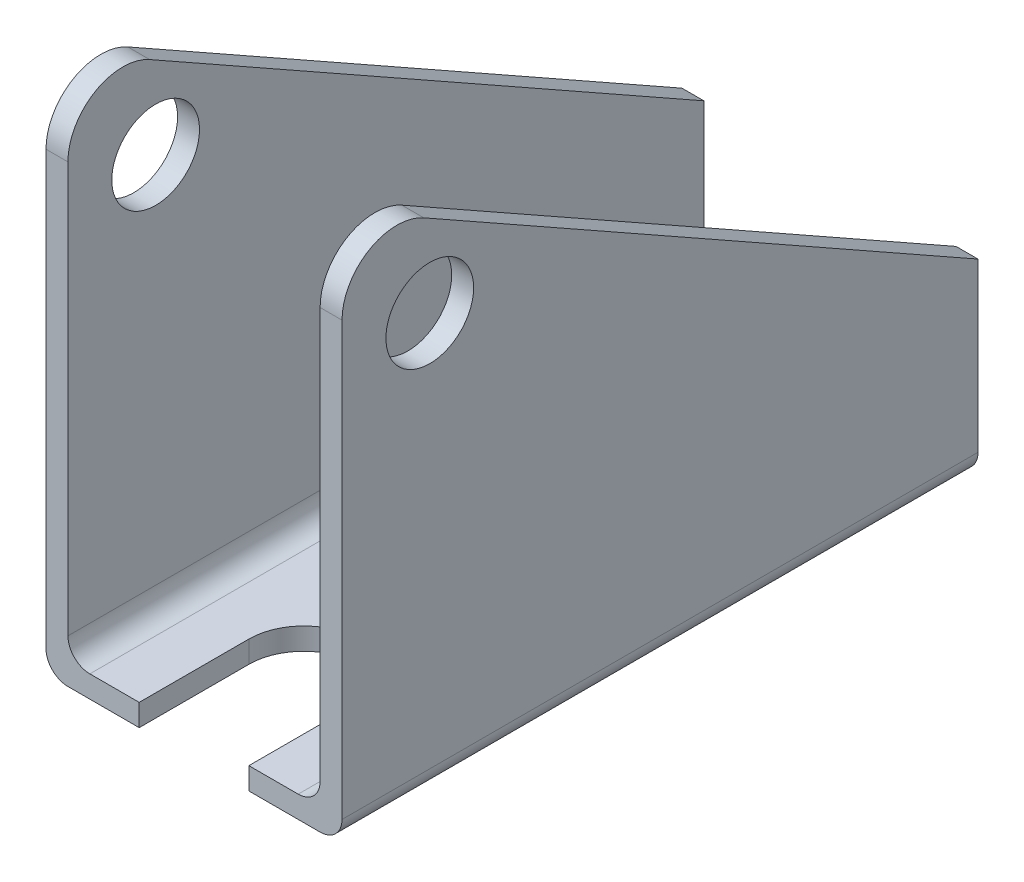
ISO-10303-21;
HEADER;
FILE_DESCRIPTION(('STEP AP214'),'2;1');
FILE_NAME('part.step','',(''),(''),'','','');
FILE_SCHEMA(('AUTOMOTIVE_DESIGN { 1 0 10303 214 1 1 1 1 }'));
ENDSEC;
DATA;
#1=APPLICATION_CONTEXT('core data for automotive mechanical design processes');
#2=APPLICATION_PROTOCOL_DEFINITION('international standard','automotive_design',2000,#1);
#3=PRODUCT_CONTEXT('',#1,'mechanical');
#4=PRODUCT('Part','Part','',(#3));
#5=PRODUCT_RELATED_PRODUCT_CATEGORY('part','',(#4));
#6=PRODUCT_DEFINITION_FORMATION('','',#4);
#7=PRODUCT_DEFINITION_CONTEXT('part definition',#1,'design');
#8=PRODUCT_DEFINITION('design','',#6,#7);
#9=PRODUCT_DEFINITION_SHAPE('','',#8);
#10=(LENGTH_UNIT() NAMED_UNIT(*) SI_UNIT(.MILLI.,.METRE.));
#11=(NAMED_UNIT(*) PLANE_ANGLE_UNIT() SI_UNIT($,.RADIAN.));
#12=(NAMED_UNIT(*) SI_UNIT($,.STERADIAN.) SOLID_ANGLE_UNIT());
#13=UNCERTAINTY_MEASURE_WITH_UNIT(LENGTH_MEASURE(1.E-05),#10,'distance_accuracy_value','');
#14=(GEOMETRIC_REPRESENTATION_CONTEXT(3) GLOBAL_UNCERTAINTY_ASSIGNED_CONTEXT((#13)) GLOBAL_UNIT_ASSIGNED_CONTEXT((#10,
#11,#12)) REPRESENTATION_CONTEXT('',''));
#15=CARTESIAN_POINT('',(0.,0.,0.));
#16=DIRECTION('',(0.,0.,1.));
#17=DIRECTION('',(1.,0.,0.));
#18=AXIS2_PLACEMENT_3D('',#15,#16,#17);
#19=CARTESIAN_POINT('',(-13.5,2.,29.));
#20=DIRECTION('',(0.,0.,-1.));
#21=DIRECTION('',(-1.,0.,0.));
#22=AXIS2_PLACEMENT_3D('',#19,#20,#21);
#23=PLANE('',#22);
#24=DIRECTION('',(1.,0.,0.));
#25=VECTOR('',#24,1.);
#26=CARTESIAN_POINT('',(-13.5,0.,29.));
#27=LINE('',#26,#25);
#28=CARTESIAN_POINT('',(-11.5,0.,29.));
#29=VERTEX_POINT('',#28);
#30=CARTESIAN_POINT('',(-5.,0.,29.));
#31=VERTEX_POINT('',#30);
#32=EDGE_CURVE('E336',#29,#31,#27,.T.);
#33=ORIENTED_EDGE('',*,*,#32,.T.);
#34=DIRECTION('',(0.,1.,0.));
#35=VECTOR('',#34,1.);
#36=CARTESIAN_POINT('',(-5.,2.,29.));
#37=LINE('',#36,#35);
#38=CARTESIAN_POINT('',(-5.,2.00000000000002,29.));
#39=VERTEX_POINT('',#38);
#40=EDGE_CURVE('E55',#31,#39,#37,.T.);
#41=ORIENTED_EDGE('',*,*,#40,.T.);
#42=DIRECTION('',(1.,0.,0.));
#43=VECTOR('',#42,1.);
#44=CARTESIAN_POINT('',(-13.5,2.,29.));
#45=LINE('',#44,#43);
#46=CARTESIAN_POINT('',(-9.49999999999998,2.,29.));
#47=VERTEX_POINT('',#46);
#48=EDGE_CURVE('E337',#47,#39,#45,.T.);
#49=ORIENTED_EDGE('',*,*,#48,.F.);
#50=CARTESIAN_POINT('',(-9.49999999999999,4.,29.));
#51=DIRECTION('',(0.,0.,-1.));
#52=DIRECTION('',(1.,0.,0.));
#53=AXIS2_PLACEMENT_3D('',#50,#51,#52);
#54=CIRCLE('',#53,2.);
#55=CARTESIAN_POINT('',(-11.5,4.00000000000001,29.));
#56=VERTEX_POINT('',#55);
#57=EDGE_CURVE('E310',#47,#56,#54,.T.);
#58=ORIENTED_EDGE('',*,*,#57,.T.);
#59=DIRECTION('',(0.,1.,0.));
#60=VECTOR('',#59,1.);
#61=CARTESIAN_POINT('',(-11.5,50.,29.));
#62=LINE('',#61,#60);
#63=CARTESIAN_POINT('',(-11.5,41.4361944646601,29.));
#64=VERTEX_POINT('',#63);
#65=EDGE_CURVE('E291',#56,#64,#62,.T.);
#66=ORIENTED_EDGE('',*,*,#65,.T.);
#67=DIRECTION('',(1.,0.,0.));
#68=VECTOR('',#67,1.);
#69=CARTESIAN_POINT('',(-44.5,41.4361944646601,29.));
#70=LINE('',#69,#68);
#71=CARTESIAN_POINT('',(-13.5,41.4361944646601,29.));
#72=VERTEX_POINT('',#71);
#73=EDGE_CURVE('E246',#72,#64,#70,.T.);
#74=ORIENTED_EDGE('',*,*,#73,.F.);
#75=DIRECTION('',(0.,-1.,0.));
#76=VECTOR('',#75,1.);
#77=CARTESIAN_POINT('',(-13.5,2.,29.));
#78=LINE('',#77,#76);
#79=CARTESIAN_POINT('',(-13.5,2.00000000000001,29.));
#80=VERTEX_POINT('',#79);
#81=EDGE_CURVE('E350',#72,#80,#78,.T.);
#82=ORIENTED_EDGE('',*,*,#81,.T.);
#83=CARTESIAN_POINT('',(-11.5,2.,29.));
#84=DIRECTION('',(0.,0.,-1.));
#85=DIRECTION('',(1.,0.,0.));
#86=AXIS2_PLACEMENT_3D('',#83,#84,#85);
#87=CIRCLE('',#86,2.);
#88=EDGE_CURVE('E214',#29,#80,#87,.T.);
#89=ORIENTED_EDGE('',*,*,#88,.F.);
#90=EDGE_LOOP('',(#33,#41,#49,#58,#66,#74,#82,#89));
#91=FACE_BOUND('',#90,.T.);
#92=ADVANCED_FACE('F45',(#91),#23,.F.);
#93=CARTESIAN_POINT('',(-13.5,2.,-29.));
#94=DIRECTION('',(1.,0.,0.));
#95=DIRECTION('',(0.,0.,-1.));
#96=AXIS2_PLACEMENT_3D('',#93,#94,#95);
#97=PLANE('',#96);
#98=CARTESIAN_POINT('',(-13.5,38.,21.));
#99=DIRECTION('',(1.,0.,0.));
#100=DIRECTION('',(0.,0.,-1.));
#101=AXIS2_PLACEMENT_3D('',#98,#99,#100);
#102=CIRCLE('',#101,4.);
#103=CARTESIAN_POINT('',(-13.5,38.,17.));
#104=VERTEX_POINT('',#103);
#105=EDGE_CURVE('E267',#104,#104,#102,.T.);
#106=ORIENTED_EDGE('',*,*,#105,.T.);
#107=EDGE_LOOP('',(#106));
#108=FACE_BOUND('',#107,.T.);
#109=DIRECTION('',(0.,0.,1.));
#110=VECTOR('',#109,1.);
#111=CARTESIAN_POINT('',(-13.5,2.00000000000001,-29.));
#112=LINE('',#111,#110);
#113=CARTESIAN_POINT('',(-13.5,2.00000000000001,-29.));
#114=VERTEX_POINT('',#113);
#115=EDGE_CURVE('E218',#114,#80,#112,.T.);
#116=ORIENTED_EDGE('',*,*,#115,.T.);
#117=ORIENTED_EDGE('',*,*,#81,.F.);
#118=CARTESIAN_POINT('',(-13.5,41.4361944646602,24.));
#119=DIRECTION('',(1.,0.,0.));
#120=DIRECTION('',(0.,0.,-1.));
#121=AXIS2_PLACEMENT_3D('',#118,#119,#120);
#122=CIRCLE('',#121,5.);
#123=CARTESIAN_POINT('',(-13.5,45.7904313283322,21.5422324489408));
#124=VERTEX_POINT('',#123);
#125=EDGE_CURVE('E254',#72,#124,#122,.F.);
#126=ORIENTED_EDGE('',*,*,#125,.T.);
#127=DIRECTION('',(0.,-0.491553510211827,-0.870847372734414));
#128=VECTOR('',#127,1.);
#129=CARTESIAN_POINT('',(-13.5,13.5740582269965,-35.5330264831737));
#130=LINE('',#129,#128);
#131=CARTESIAN_POINT('',(-13.5,17.261652862584,-29.));
#132=VERTEX_POINT('',#131);
#133=EDGE_CURVE('E283',#124,#132,#130,.T.);
#134=ORIENTED_EDGE('',*,*,#133,.T.);
#135=DIRECTION('',(0.,-1.,0.));
#136=VECTOR('',#135,1.);
#137=CARTESIAN_POINT('',(-13.5,2.,-29.));
#138=LINE('',#137,#136);
#139=EDGE_CURVE('E354',#132,#114,#138,.T.);
#140=ORIENTED_EDGE('',*,*,#139,.T.);
#141=EDGE_LOOP('',(#116,#117,#126,#134,#140));
#142=FACE_BOUND('',#141,.T.);
#143=ADVANCED_FACE('F401',(#108,#142),#97,.F.);
#144=CARTESIAN_POINT('',(0.,0.,0.));
#145=DIRECTION('',(0.,1.,0.));
#146=DIRECTION('',(0.,0.,1.));
#147=AXIS2_PLACEMENT_3D('',#144,#145,#146);
#148=PLANE('',#147);
#149=CARTESIAN_POINT('',(0.,0.,-11.));
#150=DIRECTION('',(0.,-1.,0.));
#151=DIRECTION('',(0.,0.,-1.));
#152=AXIS2_PLACEMENT_3D('',#149,#150,#151);
#153=CIRCLE('',#152,5.);
#154=CARTESIAN_POINT('',(0.,0.,-16.));
#155=VERTEX_POINT('',#154);
#156=EDGE_CURVE('E195',#155,#155,#153,.T.);
#157=ORIENTED_EDGE('',*,*,#156,.F.);
#158=EDGE_LOOP('',(#157));
#159=FACE_BOUND('',#158,.T.);
#160=CARTESIAN_POINT('',(0.,0.,19.));
#161=DIRECTION('',(0.,-1.,0.));
#162=DIRECTION('',(0.,0.,-1.));
#163=AXIS2_PLACEMENT_3D('',#160,#161,#162);
#164=CIRCLE('',#163,5.);
#165=CARTESIAN_POINT('',(-5.,0.,19.));
#166=VERTEX_POINT('',#165);
#167=CARTESIAN_POINT('',(5.,0.,19.));
#168=VERTEX_POINT('',#167);
#169=EDGE_CURVE('E177',#166,#168,#164,.T.);
#170=ORIENTED_EDGE('',*,*,#169,.F.);
#171=DIRECTION('',(0.,0.,-1.));
#172=VECTOR('',#171,1.);
#173=CARTESIAN_POINT('',(-5.,0.,19.));
#174=LINE('',#173,#172);
#175=EDGE_CURVE('E185',#31,#166,#174,.T.);
#176=ORIENTED_EDGE('',*,*,#175,.F.);
#177=ORIENTED_EDGE('',*,*,#32,.F.);
#178=DIRECTION('',(0.,0.,1.));
#179=VECTOR('',#178,1.);
#180=CARTESIAN_POINT('',(-11.5,0.,-29.));
#181=LINE('',#180,#179);
#182=CARTESIAN_POINT('',(-11.5,0.,-29.));
#183=VERTEX_POINT('',#182);
#184=EDGE_CURVE('E213',#183,#29,#181,.T.);
#185=ORIENTED_EDGE('',*,*,#184,.F.);
#186=DIRECTION('',(-1.,0.,0.));
#187=VECTOR('',#186,1.);
#188=CARTESIAN_POINT('',(-13.5,0.,-29.));
#189=LINE('',#188,#187);
#190=CARTESIAN_POINT('',(11.5,0.,-29.));
#191=VERTEX_POINT('',#190);
#192=EDGE_CURVE('E320',#191,#183,#189,.T.);
#193=ORIENTED_EDGE('',*,*,#192,.F.);
#194=DIRECTION('',(0.,0.,1.));
#195=VECTOR('',#194,1.);
#196=CARTESIAN_POINT('',(11.5,0.,-29.));
#197=LINE('',#196,#195);
#198=CARTESIAN_POINT('',(11.5,0.,29.));
#199=VERTEX_POINT('',#198);
#200=EDGE_CURVE('E229',#191,#199,#197,.T.);
#201=ORIENTED_EDGE('',*,*,#200,.T.);
#202=CARTESIAN_POINT('',(5.,0.,29.));
#203=VERTEX_POINT('',#202);
#204=EDGE_CURVE('E69',#203,#199,#27,.T.);
#205=ORIENTED_EDGE('',*,*,#204,.F.);
#206=DIRECTION('',(0.,0.,1.));
#207=VECTOR('',#206,1.);
#208=CARTESIAN_POINT('',(5.,0.,19.));
#209=LINE('',#208,#207);
#210=EDGE_CURVE('E62',#168,#203,#209,.T.);
#211=ORIENTED_EDGE('',*,*,#210,.F.);
#212=EDGE_LOOP('',(#170,#176,#177,#185,#193,#201,#205,#211));
#213=FACE_BOUND('',#212,.T.);
#214=ADVANCED_FACE('F193',(#159,#213),#148,.F.);
#215=CARTESIAN_POINT('',(-44.5,17.261652862584,-29.));
#216=DIRECTION('',(0.,-0.870847372734414,0.491553510211827));
#217=DIRECTION('',(0.,-0.491553510211827,-0.870847372734414));
#218=AXIS2_PLACEMENT_3D('',#215,#216,#217);
#219=PLANE('',#218);
#220=DIRECTION('',(1.,0.,0.));
#221=VECTOR('',#220,1.);
#222=CARTESIAN_POINT('',(-44.5,45.7904313283322,21.5422324489408));
#223=LINE('',#222,#221);
#224=CARTESIAN_POINT('',(-11.5,45.7904313283322,21.5422324489409));
#225=VERTEX_POINT('',#224);
#226=EDGE_CURVE('E241',#124,#225,#223,.T.);
#227=ORIENTED_EDGE('',*,*,#226,.T.);
#228=DIRECTION('',(0.,-0.491553510211827,-0.870847372734414));
#229=VECTOR('',#228,1.);
#230=CARTESIAN_POINT('',(-11.5,25.1720511902718,-14.985758502709));
#231=LINE('',#230,#229);
#232=CARTESIAN_POINT('',(-11.5,17.261652862584,-29.));
#233=VERTEX_POINT('',#232);
#234=EDGE_CURVE('E362',#225,#233,#231,.T.);
#235=ORIENTED_EDGE('',*,*,#234,.T.);
#236=DIRECTION('',(1.,0.,0.));
#237=VECTOR('',#236,1.);
#238=CARTESIAN_POINT('',(-44.5,17.261652862584,-29.));
#239=LINE('',#238,#237);
#240=EDGE_CURVE('E278',#132,#233,#239,.T.);
#241=ORIENTED_EDGE('',*,*,#240,.F.);
#242=ORIENTED_EDGE('',*,*,#133,.F.);
#243=EDGE_LOOP('',(#227,#235,#241,#242));
#244=FACE_BOUND('',#243,.T.);
#245=ADVANCED_FACE('F396',(#244),#219,.F.);
#246=DIRECTION('',(1.,0.,0.));
#247=VECTOR('',#246,1.);
#248=CARTESIAN_POINT('',(-44.5,45.7904313283322,21.5422324489409));
#249=LINE('',#248,#247);
#250=CARTESIAN_POINT('',(13.5,45.7904313283322,21.5422324489408));
#251=VERTEX_POINT('',#250);
#252=CARTESIAN_POINT('',(11.5,45.7904313283322,21.5422324489408));
#253=VERTEX_POINT('',#252);
#254=EDGE_CURVE('E365',#251,#253,#249,.F.);
#255=ORIENTED_EDGE('',*,*,#254,.F.);
#256=DIRECTION('',(0.,-0.491553510211827,-0.870847372734414));
#257=VECTOR('',#256,1.);
#258=CARTESIAN_POINT('',(13.5,17.261652862584,-29.));
#259=LINE('',#258,#257);
#260=CARTESIAN_POINT('',(13.5,17.261652862584,-29.));
#261=VERTEX_POINT('',#260);
#262=EDGE_CURVE('E271',#251,#261,#259,.T.);
#263=ORIENTED_EDGE('',*,*,#262,.T.);
#264=CARTESIAN_POINT('',(11.5,17.261652862584,-29.));
#265=VERTEX_POINT('',#264);
#266=EDGE_CURVE('E274',#265,#261,#239,.T.);
#267=ORIENTED_EDGE('',*,*,#266,.F.);
#268=DIRECTION('',(0.,0.491553510211827,0.870847372734414));
#269=VECTOR('',#268,1.);
#270=CARTESIAN_POINT('',(11.5,25.1720511902718,-14.985758502709));
#271=LINE('',#270,#269);
#272=EDGE_CURVE('E279',#265,#253,#271,.T.);
#273=ORIENTED_EDGE('',*,*,#272,.T.);
#274=EDGE_LOOP('',(#255,#263,#267,#273));
#275=FACE_BOUND('',#274,.T.);
#276=ADVANCED_FACE('F412',(#275),#219,.F.);
#277=CARTESIAN_POINT('',(0.,2.,0.));
#278=DIRECTION('',(0.,1.,0.));
#279=DIRECTION('',(0.,0.,1.));
#280=AXIS2_PLACEMENT_3D('',#277,#278,#279);
#281=PLANE('',#280);
#282=CARTESIAN_POINT('',(0.,2.,-11.));
#283=DIRECTION('',(0.,1.,0.));
#284=DIRECTION('',(0.,0.,1.));
#285=AXIS2_PLACEMENT_3D('',#282,#283,#284);
#286=CIRCLE('',#285,5.);
#287=CARTESIAN_POINT('',(0.,2.,-16.));
#288=VERTEX_POINT('',#287);
#289=EDGE_CURVE('E49',#288,#288,#286,.T.);
#290=ORIENTED_EDGE('',*,*,#289,.F.);
#291=EDGE_LOOP('',(#290));
#292=FACE_BOUND('',#291,.T.);
#293=DIRECTION('',(0.,0.,1.));
#294=VECTOR('',#293,1.);
#295=CARTESIAN_POINT('',(-5.,2.,0.));
#296=LINE('',#295,#294);
#297=CARTESIAN_POINT('',(-5.,2.00000000000002,19.));
#298=VERTEX_POINT('',#297);
#299=EDGE_CURVE('E206',#298,#39,#296,.T.);
#300=ORIENTED_EDGE('',*,*,#299,.F.);
#301=CARTESIAN_POINT('',(0.,2.,19.));
#302=DIRECTION('',(0.,1.,0.));
#303=DIRECTION('',(0.,0.,1.));
#304=AXIS2_PLACEMENT_3D('',#301,#302,#303);
#305=CIRCLE('',#304,5.);
#306=CARTESIAN_POINT('',(5.,2.00000000000002,19.));
#307=VERTEX_POINT('',#306);
#308=EDGE_CURVE('E11',#307,#298,#305,.T.);
#309=ORIENTED_EDGE('',*,*,#308,.F.);
#310=DIRECTION('',(0.,0.,-1.));
#311=VECTOR('',#310,1.);
#312=CARTESIAN_POINT('',(5.,2.,0.));
#313=LINE('',#312,#311);
#314=CARTESIAN_POINT('',(5.,2.00000000000002,29.));
#315=VERTEX_POINT('',#314);
#316=EDGE_CURVE('E200',#315,#307,#313,.T.);
#317=ORIENTED_EDGE('',*,*,#316,.F.);
#318=CARTESIAN_POINT('',(9.50000000000001,2.,29.));
#319=VERTEX_POINT('',#318);
#320=EDGE_CURVE('E335',#315,#319,#45,.T.);
#321=ORIENTED_EDGE('',*,*,#320,.T.);
#322=DIRECTION('',(0.,0.,1.));
#323=VECTOR('',#322,1.);
#324=CARTESIAN_POINT('',(9.5,2.,-29.));
#325=LINE('',#324,#323);
#326=CARTESIAN_POINT('',(9.5,2.,-29.));
#327=VERTEX_POINT('',#326);
#328=EDGE_CURVE('E325',#327,#319,#325,.T.);
#329=ORIENTED_EDGE('',*,*,#328,.F.);
#330=DIRECTION('',(-1.,0.,0.));
#331=VECTOR('',#330,1.);
#332=CARTESIAN_POINT('',(-13.5,2.,-29.));
#333=LINE('',#332,#331);
#334=CARTESIAN_POINT('',(-9.49999999999999,2.,-29.));
#335=VERTEX_POINT('',#334);
#336=EDGE_CURVE('E332',#327,#335,#333,.T.);
#337=ORIENTED_EDGE('',*,*,#336,.T.);
#338=DIRECTION('',(0.,0.,1.));
#339=VECTOR('',#338,1.);
#340=CARTESIAN_POINT('',(-9.49999999999998,2.,-29.));
#341=LINE('',#340,#339);
#342=EDGE_CURVE('E321',#335,#47,#341,.T.);
#343=ORIENTED_EDGE('',*,*,#342,.T.);
#344=ORIENTED_EDGE('',*,*,#48,.T.);
#345=EDGE_LOOP('',(#300,#309,#317,#321,#329,#337,#343,#344));
#346=FACE_BOUND('',#345,.T.);
#347=ADVANCED_FACE('F378',(#292,#346),#281,.T.);
#348=CARTESIAN_POINT('',(13.5,2.,-29.));
#349=DIRECTION('',(-1.,0.,0.));
#350=DIRECTION('',(0.,0.,1.));
#351=AXIS2_PLACEMENT_3D('',#348,#349,#350);
#352=PLANE('',#351);
#353=CARTESIAN_POINT('',(13.5,38.,21.));
#354=DIRECTION('',(1.,0.,0.));
#355=DIRECTION('',(0.,0.,-1.));
#356=AXIS2_PLACEMENT_3D('',#353,#354,#355);
#357=CIRCLE('',#356,4.);
#358=CARTESIAN_POINT('',(13.5,38.,17.));
#359=VERTEX_POINT('',#358);
#360=EDGE_CURVE('E258',#359,#359,#357,.T.);
#361=ORIENTED_EDGE('',*,*,#360,.F.);
#362=EDGE_LOOP('',(#361));
#363=FACE_BOUND('',#362,.T.);
#364=DIRECTION('',(0.,-1.,0.));
#365=VECTOR('',#364,1.);
#366=CARTESIAN_POINT('',(13.5,2.,29.));
#367=LINE('',#366,#365);
#368=CARTESIAN_POINT('',(13.5,41.4361944646601,29.));
#369=VERTEX_POINT('',#368);
#370=CARTESIAN_POINT('',(13.5,2.00000000000001,29.));
#371=VERTEX_POINT('',#370);
#372=EDGE_CURVE('E341',#369,#371,#367,.T.);
#373=ORIENTED_EDGE('',*,*,#372,.T.);
#374=DIRECTION('',(0.,0.,1.));
#375=VECTOR('',#374,1.);
#376=CARTESIAN_POINT('',(13.5,2.00000000000001,-29.));
#377=LINE('',#376,#375);
#378=CARTESIAN_POINT('',(13.5,2.00000000000001,-29.));
#379=VERTEX_POINT('',#378);
#380=EDGE_CURVE('E225',#379,#371,#377,.T.);
#381=ORIENTED_EDGE('',*,*,#380,.F.);
#382=DIRECTION('',(0.,-1.,0.));
#383=VECTOR('',#382,1.);
#384=CARTESIAN_POINT('',(13.5,2.,-29.));
#385=LINE('',#384,#383);
#386=EDGE_CURVE('E358',#261,#379,#385,.T.);
#387=ORIENTED_EDGE('',*,*,#386,.F.);
#388=ORIENTED_EDGE('',*,*,#262,.F.);
#389=CARTESIAN_POINT('',(13.5,41.4361944646602,24.));
#390=DIRECTION('',(-1.,0.,0.));
#391=DIRECTION('',(0.,0.,-1.));
#392=AXIS2_PLACEMENT_3D('',#389,#390,#391);
#393=CIRCLE('',#392,5.);
#394=EDGE_CURVE('E222',#369,#251,#393,.T.);
#395=ORIENTED_EDGE('',*,*,#394,.F.);
#396=EDGE_LOOP('',(#373,#381,#387,#388,#395));
#397=FACE_BOUND('',#396,.T.);
#398=ADVANCED_FACE('F47',(#363,#397),#352,.F.);
#399=CARTESIAN_POINT('',(-13.5,2.,-29.));
#400=DIRECTION('',(0.,0.,1.));
#401=DIRECTION('',(1.,0.,0.));
#402=AXIS2_PLACEMENT_3D('',#399,#400,#401);
#403=PLANE('',#402);
#404=ORIENTED_EDGE('',*,*,#192,.T.);
#405=CARTESIAN_POINT('',(-11.5,2.,-29.));
#406=DIRECTION('',(0.,0.,-1.));
#407=DIRECTION('',(1.,0.,0.));
#408=AXIS2_PLACEMENT_3D('',#405,#406,#407);
#409=CIRCLE('',#408,2.);
#410=EDGE_CURVE('E209',#183,#114,#409,.T.);
#411=ORIENTED_EDGE('',*,*,#410,.T.);
#412=ORIENTED_EDGE('',*,*,#139,.F.);
#413=ORIENTED_EDGE('',*,*,#240,.T.);
#414=DIRECTION('',(0.,1.,0.));
#415=VECTOR('',#414,1.);
#416=CARTESIAN_POINT('',(-11.5,50.,-29.));
#417=LINE('',#416,#415);
#418=CARTESIAN_POINT('',(-11.5,4.00000000000001,-29.));
#419=VERTEX_POINT('',#418);
#420=EDGE_CURVE('E299',#419,#233,#417,.T.);
#421=ORIENTED_EDGE('',*,*,#420,.F.);
#422=CARTESIAN_POINT('',(-9.49999999999999,4.,-29.));
#423=DIRECTION('',(0.,0.,-1.));
#424=DIRECTION('',(1.,0.,0.));
#425=AXIS2_PLACEMENT_3D('',#422,#423,#424);
#426=CIRCLE('',#425,2.);
#427=EDGE_CURVE('E295',#335,#419,#426,.T.);
#428=ORIENTED_EDGE('',*,*,#427,.F.);
#429=ORIENTED_EDGE('',*,*,#336,.F.);
#430=CARTESIAN_POINT('',(9.50000000000001,4.,-29.));
#431=DIRECTION('',(0.,0.,-1.));
#432=DIRECTION('',(-1.,0.,0.));
#433=AXIS2_PLACEMENT_3D('',#430,#431,#432);
#434=CIRCLE('',#433,2.);
#435=CARTESIAN_POINT('',(11.5,4.00000000000002,-29.));
#436=VERTEX_POINT('',#435);
#437=EDGE_CURVE('E290',#436,#327,#434,.T.);
#438=ORIENTED_EDGE('',*,*,#437,.F.);
#439=DIRECTION('',(0.,-1.,0.));
#440=VECTOR('',#439,1.);
#441=CARTESIAN_POINT('',(11.5,50.,-29.));
#442=LINE('',#441,#440);
#443=EDGE_CURVE('E287',#265,#436,#442,.T.);
#444=ORIENTED_EDGE('',*,*,#443,.F.);
#445=ORIENTED_EDGE('',*,*,#266,.T.);
#446=ORIENTED_EDGE('',*,*,#386,.T.);
#447=CARTESIAN_POINT('',(11.5,2.,-29.));
#448=DIRECTION('',(0.,0.,-1.));
#449=DIRECTION('',(1.,0.,0.));
#450=AXIS2_PLACEMENT_3D('',#447,#448,#449);
#451=CIRCLE('',#450,2.);
#452=EDGE_CURVE('E228',#379,#191,#451,.T.);
#453=ORIENTED_EDGE('',*,*,#452,.T.);
#454=EDGE_LOOP('',(#404,#411,#412,#413,#421,#428,#429,#438,#444,#445,#446,#453));
#455=FACE_BOUND('',#454,.T.);
#456=ADVANCED_FACE('F419',(#455),#403,.F.);
#457=ORIENTED_EDGE('',*,*,#320,.F.);
#458=DIRECTION('',(0.,-1.,0.));
#459=VECTOR('',#458,1.);
#460=CARTESIAN_POINT('',(5.,2.,29.));
#461=LINE('',#460,#459);
#462=EDGE_CURVE('E371',#315,#203,#461,.T.);
#463=ORIENTED_EDGE('',*,*,#462,.T.);
#464=ORIENTED_EDGE('',*,*,#204,.T.);
#465=CARTESIAN_POINT('',(11.5,2.,29.));
#466=DIRECTION('',(0.,0.,-1.));
#467=DIRECTION('',(1.,0.,0.));
#468=AXIS2_PLACEMENT_3D('',#465,#466,#467);
#469=CIRCLE('',#468,2.);
#470=EDGE_CURVE('E217',#371,#199,#469,.T.);
#471=ORIENTED_EDGE('',*,*,#470,.F.);
#472=ORIENTED_EDGE('',*,*,#372,.F.);
#473=CARTESIAN_POINT('',(11.5,41.4361944646601,29.));
#474=VERTEX_POINT('',#473);
#475=EDGE_CURVE('E240',#474,#369,#70,.T.);
#476=ORIENTED_EDGE('',*,*,#475,.F.);
#477=DIRECTION('',(0.,-1.,0.));
#478=VECTOR('',#477,1.);
#479=CARTESIAN_POINT('',(11.5,50.,29.));
#480=LINE('',#479,#478);
#481=CARTESIAN_POINT('',(11.5,4.00000000000002,29.));
#482=VERTEX_POINT('',#481);
#483=EDGE_CURVE('E286',#474,#482,#480,.T.);
#484=ORIENTED_EDGE('',*,*,#483,.T.);
#485=CARTESIAN_POINT('',(9.50000000000001,4.,29.));
#486=DIRECTION('',(0.,0.,-1.));
#487=DIRECTION('',(-1.,0.,0.));
#488=AXIS2_PLACEMENT_3D('',#485,#486,#487);
#489=CIRCLE('',#488,2.);
#490=EDGE_CURVE('E306',#482,#319,#489,.T.);
#491=ORIENTED_EDGE('',*,*,#490,.T.);
#492=EDGE_LOOP('',(#457,#463,#464,#471,#472,#476,#484,#491));
#493=FACE_BOUND('',#492,.T.);
#494=ADVANCED_FACE('F428',(#493),#23,.F.);
#495=CARTESIAN_POINT('',(11.5,50.,-29.));
#496=DIRECTION('',(-1.,0.,0.));
#497=DIRECTION('',(0.,-1.,0.));
#498=AXIS2_PLACEMENT_3D('',#495,#496,#497);
#499=PLANE('',#498);
#500=CARTESIAN_POINT('',(11.5,41.4361944646602,24.));
#501=DIRECTION('',(-1.,0.,0.));
#502=DIRECTION('',(0.,-1.,0.));
#503=AXIS2_PLACEMENT_3D('',#500,#501,#502);
#504=CIRCLE('',#503,5.);
#505=EDGE_CURVE('E251',#253,#474,#504,.F.);
#506=ORIENTED_EDGE('',*,*,#505,.F.);
#507=ORIENTED_EDGE('',*,*,#272,.F.);
#508=ORIENTED_EDGE('',*,*,#443,.T.);
#509=DIRECTION('',(0.,0.,1.));
#510=VECTOR('',#509,1.);
#511=CARTESIAN_POINT('',(11.5,4.00000000000002,-29.));
#512=LINE('',#511,#510);
#513=EDGE_CURVE('E303',#436,#482,#512,.T.);
#514=ORIENTED_EDGE('',*,*,#513,.T.);
#515=ORIENTED_EDGE('',*,*,#483,.F.);
#516=EDGE_LOOP('',(#506,#507,#508,#514,#515));
#517=FACE_BOUND('',#516,.T.);
#518=CARTESIAN_POINT('',(11.5,38.,21.));
#519=DIRECTION('',(-1.,0.,0.));
#520=DIRECTION('',(0.,-1.,0.));
#521=AXIS2_PLACEMENT_3D('',#518,#519,#520);
#522=CIRCLE('',#521,4.);
#523=CARTESIAN_POINT('',(11.5,38.,17.));
#524=VERTEX_POINT('',#523);
#525=EDGE_CURVE('E263',#524,#524,#522,.T.);
#526=ORIENTED_EDGE('',*,*,#525,.F.);
#527=EDGE_LOOP('',(#526));
#528=FACE_BOUND('',#527,.T.);
#529=ADVANCED_FACE('F435',(#517,#528),#499,.T.);
#530=CARTESIAN_POINT('',(9.50000000000001,4.,-29.));
#531=DIRECTION('',(0.,0.,1.));
#532=DIRECTION('',(1.,0.,0.));
#533=AXIS2_PLACEMENT_3D('',#530,#531,#532);
#534=CYLINDRICAL_SURFACE('',#533,2.);
#535=ORIENTED_EDGE('',*,*,#490,.F.);
#536=ORIENTED_EDGE('',*,*,#513,.F.);
#537=ORIENTED_EDGE('',*,*,#437,.T.);
#538=ORIENTED_EDGE('',*,*,#328,.T.);
#539=EDGE_LOOP('',(#535,#536,#537,#538));
#540=FACE_BOUND('',#539,.T.);
#541=ADVANCED_FACE('F440',(#540),#534,.F.);
#542=CARTESIAN_POINT('',(-11.5,50.,-29.));
#543=DIRECTION('',(1.,0.,0.));
#544=DIRECTION('',(0.,1.,0.));
#545=AXIS2_PLACEMENT_3D('',#542,#543,#544);
#546=PLANE('',#545);
#547=CARTESIAN_POINT('',(-11.5,41.4361944646602,24.));
#548=DIRECTION('',(1.,0.,0.));
#549=DIRECTION('',(0.,1.,0.));
#550=AXIS2_PLACEMENT_3D('',#547,#548,#549);
#551=CIRCLE('',#550,5.);
#552=EDGE_CURVE('E245',#64,#225,#551,.F.);
#553=ORIENTED_EDGE('',*,*,#552,.F.);
#554=ORIENTED_EDGE('',*,*,#65,.F.);
#555=DIRECTION('',(0.,0.,1.));
#556=VECTOR('',#555,1.);
#557=CARTESIAN_POINT('',(-11.5,4.00000000000001,-29.));
#558=LINE('',#557,#556);
#559=EDGE_CURVE('E317',#419,#56,#558,.T.);
#560=ORIENTED_EDGE('',*,*,#559,.F.);
#561=ORIENTED_EDGE('',*,*,#420,.T.);
#562=ORIENTED_EDGE('',*,*,#234,.F.);
#563=EDGE_LOOP('',(#553,#554,#560,#561,#562));
#564=FACE_BOUND('',#563,.T.);
#565=CARTESIAN_POINT('',(-11.5,38.,21.));
#566=DIRECTION('',(1.,0.,0.));
#567=DIRECTION('',(0.,1.,0.));
#568=AXIS2_PLACEMENT_3D('',#565,#566,#567);
#569=CIRCLE('',#568,4.);
#570=CARTESIAN_POINT('',(-11.5,38.,17.));
#571=VERTEX_POINT('',#570);
#572=EDGE_CURVE('E262',#571,#571,#569,.T.);
#573=ORIENTED_EDGE('',*,*,#572,.F.);
#574=EDGE_LOOP('',(#573));
#575=FACE_BOUND('',#574,.T.);
#576=ADVANCED_FACE('F389',(#564,#575),#546,.T.);
#577=CARTESIAN_POINT('',(-9.49999999999999,4.,-29.));
#578=DIRECTION('',(0.,0.,1.));
#579=DIRECTION('',(1.,0.,0.));
#580=AXIS2_PLACEMENT_3D('',#577,#578,#579);
#581=CYLINDRICAL_SURFACE('',#580,2.);
#582=ORIENTED_EDGE('',*,*,#57,.F.);
#583=ORIENTED_EDGE('',*,*,#342,.F.);
#584=ORIENTED_EDGE('',*,*,#427,.T.);
#585=ORIENTED_EDGE('',*,*,#559,.T.);
#586=EDGE_LOOP('',(#582,#583,#584,#585));
#587=FACE_BOUND('',#586,.T.);
#588=ADVANCED_FACE('F384',(#587),#581,.F.);
#589=CARTESIAN_POINT('',(-44.5,38.,21.));
#590=DIRECTION('',(1.,0.,0.));
#591=DIRECTION('',(0.,0.,-1.));
#592=AXIS2_PLACEMENT_3D('',#589,#590,#591);
#593=CYLINDRICAL_SURFACE('',#592,4.);
#594=CARTESIAN_POINT('',(-11.5,38.,17.));
#595=CARTESIAN_POINT('',(-11.5208333333333,38.,17.));
#596=CARTESIAN_POINT('',(-11.5416666666667,38.,17.));
#597=CARTESIAN_POINT('',(-11.5833333333333,38.,17.));
#598=CARTESIAN_POINT('',(-11.6041666666667,38.,17.));
#599=CARTESIAN_POINT('',(-11.6458333333333,38.,17.));
#600=CARTESIAN_POINT('',(-11.6666666666667,38.,17.));
#601=CARTESIAN_POINT('',(-11.7083333333333,38.,17.));
#602=CARTESIAN_POINT('',(-11.7291666666667,38.,17.));
#603=CARTESIAN_POINT('',(-11.7708333333333,38.,17.));
#604=CARTESIAN_POINT('',(-11.7916666666667,38.,17.));
#605=CARTESIAN_POINT('',(-11.8333333333333,38.,17.));
#606=CARTESIAN_POINT('',(-11.8541666666667,38.,17.));
#607=CARTESIAN_POINT('',(-11.8958333333333,38.,17.));
#608=CARTESIAN_POINT('',(-11.9166666666667,38.,17.));
#609=CARTESIAN_POINT('',(-11.9583333333333,38.,17.));
#610=CARTESIAN_POINT('',(-11.9791666666667,38.,17.));
#611=CARTESIAN_POINT('',(-12.0208333333333,38.,17.));
#612=CARTESIAN_POINT('',(-12.0416666666667,38.,17.));
#613=CARTESIAN_POINT('',(-12.0833333333333,38.,17.));
#614=CARTESIAN_POINT('',(-12.1041666666667,38.,17.));
#615=CARTESIAN_POINT('',(-12.1458333333333,38.,17.));
#616=CARTESIAN_POINT('',(-12.1666666666667,38.,17.));
#617=CARTESIAN_POINT('',(-12.2083333333333,38.,17.));
#618=CARTESIAN_POINT('',(-12.2291666666667,38.,17.));
#619=CARTESIAN_POINT('',(-12.2708333333333,38.,17.));
#620=CARTESIAN_POINT('',(-12.2916666666667,38.,17.));
#621=CARTESIAN_POINT('',(-12.3333333333333,38.,17.));
#622=CARTESIAN_POINT('',(-12.3541666666667,38.,17.));
#623=CARTESIAN_POINT('',(-12.3958333333333,38.,17.));
#624=CARTESIAN_POINT('',(-12.4166666666667,38.,17.));
#625=CARTESIAN_POINT('',(-12.4583333333333,38.,17.));
#626=CARTESIAN_POINT('',(-12.4791666666667,38.,17.));
#627=CARTESIAN_POINT('',(-12.5208333333333,38.,17.));
#628=CARTESIAN_POINT('',(-12.5416666666667,38.,17.));
#629=CARTESIAN_POINT('',(-12.5833333333333,38.,17.));
#630=CARTESIAN_POINT('',(-12.6041666666667,38.,17.));
#631=CARTESIAN_POINT('',(-12.6458333333333,38.,17.));
#632=CARTESIAN_POINT('',(-12.6666666666667,38.,17.));
#633=CARTESIAN_POINT('',(-12.7083333333333,38.,17.));
#634=CARTESIAN_POINT('',(-12.7291666666667,38.,17.));
#635=CARTESIAN_POINT('',(-12.7708333333333,38.,17.));
#636=CARTESIAN_POINT('',(-12.7916666666667,38.,17.));
#637=CARTESIAN_POINT('',(-12.8333333333333,38.,17.));
#638=CARTESIAN_POINT('',(-12.8541666666667,38.,17.));
#639=CARTESIAN_POINT('',(-12.8958333333333,38.,17.));
#640=CARTESIAN_POINT('',(-12.9166666666667,38.,17.));
#641=CARTESIAN_POINT('',(-12.9583333333333,38.,17.));
#642=CARTESIAN_POINT('',(-12.9791666666667,38.,17.));
#643=CARTESIAN_POINT('',(-13.0208333333333,38.,17.));
#644=CARTESIAN_POINT('',(-13.0416666666667,38.,17.));
#645=CARTESIAN_POINT('',(-13.0833333333333,38.,17.));
#646=CARTESIAN_POINT('',(-13.1041666666667,38.,17.));
#647=CARTESIAN_POINT('',(-13.1458333333333,38.,17.));
#648=CARTESIAN_POINT('',(-13.1666666666667,38.,17.));
#649=CARTESIAN_POINT('',(-13.2083333333333,38.,17.));
#650=CARTESIAN_POINT('',(-13.2291666666667,38.,17.));
#651=CARTESIAN_POINT('',(-13.2708333333333,38.,17.));
#652=CARTESIAN_POINT('',(-13.2916666666667,38.,17.));
#653=CARTESIAN_POINT('',(-13.3333333333333,38.,17.));
#654=CARTESIAN_POINT('',(-13.3541666666667,38.,17.));
#655=CARTESIAN_POINT('',(-13.3958333333333,38.,17.));
#656=CARTESIAN_POINT('',(-13.4166666666667,38.,17.));
#657=CARTESIAN_POINT('',(-13.4583333333333,38.,17.));
#658=CARTESIAN_POINT('',(-13.4791666666667,38.,17.));
#659=CARTESIAN_POINT('',(-13.5,38.,17.));
#660=B_SPLINE_CURVE_WITH_KNOTS('',3,(#594,#595,#596,#597,#598,#599,#600,#601,#602,#603,#604,
#605,#606,#607,#608,#609,#610,#611,#612,#613,#614,#615,#616,#617,#618,#619,#620,#621,#622,#623,
#624,#625,#626,#627,#628,#629,#630,#631,#632,#633,#634,#635,#636,#637,#638,#639,#640,#641,#642,
#643,#644,#645,#646,#647,#648,#649,#650,#651,#652,#653,#654,#655,#656,#657,#658,#659),
.UNSPECIFIED.,.F.,.F.,(4,2,2,2,2,2,2,2,2,2,2,2,2,2,2,2,2,2,2,2,2,2,2,2,2,2,2,2,2,2,2,2,4),(0.,
0.0625000000000001,0.125,0.1875,0.25,0.3125,0.375,0.4375,0.5,0.5625,0.625000000000001,
0.687500000000001,0.750000000000001,0.812500000000001,0.875000000000001,0.937500000000001,1.,
1.0625,1.125,1.1875,1.25,1.3125,1.375,1.4375,1.5,1.5625,1.625,1.6875,1.75,1.8125,1.875,1.9375,
2.),.UNSPECIFIED.);
#661=EDGE_CURVE('BSEAM481',#571,#104,#660,.T.);
#662=ORIENTED_EDGE('',*,*,#572,.T.);
#663=ORIENTED_EDGE('',*,*,#105,.F.);
#664=ORIENTED_EDGE('',*,*,#661,.T.);
#665=ORIENTED_EDGE('',*,*,#661,.F.);
#666=EDGE_LOOP('',(#662,#664,#663,#665));
#667=FACE_BOUND('',#666,.T.);
#668=ADVANCED_FACE('F481',(#667),#593,.F.);
#669=CARTESIAN_POINT('',(11.5,38.,17.));
#670=CARTESIAN_POINT('',(11.5208333333333,38.,17.));
#671=CARTESIAN_POINT('',(11.5416666666667,38.,17.));
#672=CARTESIAN_POINT('',(11.5833333333333,38.,17.));
#673=CARTESIAN_POINT('',(11.6041666666667,38.,17.));
#674=CARTESIAN_POINT('',(11.6458333333333,38.,17.));
#675=CARTESIAN_POINT('',(11.6666666666667,38.,17.));
#676=CARTESIAN_POINT('',(11.7083333333333,38.,17.));
#677=CARTESIAN_POINT('',(11.7291666666667,38.,17.));
#678=CARTESIAN_POINT('',(11.7708333333333,38.,17.));
#679=CARTESIAN_POINT('',(11.7916666666667,38.,17.));
#680=CARTESIAN_POINT('',(11.8333333333333,38.,17.));
#681=CARTESIAN_POINT('',(11.8541666666667,38.,17.));
#682=CARTESIAN_POINT('',(11.8958333333333,38.,17.));
#683=CARTESIAN_POINT('',(11.9166666666667,38.,17.));
#684=CARTESIAN_POINT('',(11.9583333333333,38.,17.));
#685=CARTESIAN_POINT('',(11.9791666666667,38.,17.));
#686=CARTESIAN_POINT('',(12.0208333333333,38.,17.));
#687=CARTESIAN_POINT('',(12.0416666666667,38.,17.));
#688=CARTESIAN_POINT('',(12.0833333333333,38.,17.));
#689=CARTESIAN_POINT('',(12.1041666666667,38.,17.));
#690=CARTESIAN_POINT('',(12.1458333333333,38.,17.));
#691=CARTESIAN_POINT('',(12.1666666666667,38.,17.));
#692=CARTESIAN_POINT('',(12.2083333333333,38.,17.));
#693=CARTESIAN_POINT('',(12.2291666666667,38.,17.));
#694=CARTESIAN_POINT('',(12.2708333333333,38.,17.));
#695=CARTESIAN_POINT('',(12.2916666666667,38.,17.));
#696=CARTESIAN_POINT('',(12.3333333333333,38.,17.));
#697=CARTESIAN_POINT('',(12.3541666666667,38.,17.));
#698=CARTESIAN_POINT('',(12.3958333333333,38.,17.));
#699=CARTESIAN_POINT('',(12.4166666666667,38.,17.));
#700=CARTESIAN_POINT('',(12.4583333333333,38.,17.));
#701=CARTESIAN_POINT('',(12.4791666666667,38.,17.));
#702=CARTESIAN_POINT('',(12.5208333333333,38.,17.));
#703=CARTESIAN_POINT('',(12.5416666666667,38.,17.));
#704=CARTESIAN_POINT('',(12.5833333333333,38.,17.));
#705=CARTESIAN_POINT('',(12.6041666666667,38.,17.));
#706=CARTESIAN_POINT('',(12.6458333333333,38.,17.));
#707=CARTESIAN_POINT('',(12.6666666666667,38.,17.));
#708=CARTESIAN_POINT('',(12.7083333333333,38.,17.));
#709=CARTESIAN_POINT('',(12.7291666666667,38.,17.));
#710=CARTESIAN_POINT('',(12.7708333333333,38.,17.));
#711=CARTESIAN_POINT('',(12.7916666666667,38.,17.));
#712=CARTESIAN_POINT('',(12.8333333333333,38.,17.));
#713=CARTESIAN_POINT('',(12.8541666666667,38.,17.));
#714=CARTESIAN_POINT('',(12.8958333333333,38.,17.));
#715=CARTESIAN_POINT('',(12.9166666666667,38.,17.));
#716=CARTESIAN_POINT('',(12.9583333333333,38.,17.));
#717=CARTESIAN_POINT('',(12.9791666666667,38.,17.));
#718=CARTESIAN_POINT('',(13.0208333333333,38.,17.));
#719=CARTESIAN_POINT('',(13.0416666666667,38.,17.));
#720=CARTESIAN_POINT('',(13.0833333333333,38.,17.));
#721=CARTESIAN_POINT('',(13.1041666666667,38.,17.));
#722=CARTESIAN_POINT('',(13.1458333333333,38.,17.));
#723=CARTESIAN_POINT('',(13.1666666666667,38.,17.));
#724=CARTESIAN_POINT('',(13.2083333333333,38.,17.));
#725=CARTESIAN_POINT('',(13.2291666666667,38.,17.));
#726=CARTESIAN_POINT('',(13.2708333333333,38.,17.));
#727=CARTESIAN_POINT('',(13.2916666666667,38.,17.));
#728=CARTESIAN_POINT('',(13.3333333333333,38.,17.));
#729=CARTESIAN_POINT('',(13.3541666666667,38.,17.));
#730=CARTESIAN_POINT('',(13.3958333333333,38.,17.));
#731=CARTESIAN_POINT('',(13.4166666666667,38.,17.));
#732=CARTESIAN_POINT('',(13.4583333333333,38.,17.));
#733=CARTESIAN_POINT('',(13.4791666666667,38.,17.));
#734=CARTESIAN_POINT('',(13.5,38.,17.));
#735=B_SPLINE_CURVE_WITH_KNOTS('',3,(#669,#670,#671,#672,#673,#674,#675,#676,#677,#678,#679,
#680,#681,#682,#683,#684,#685,#686,#687,#688,#689,#690,#691,#692,#693,#694,#695,#696,#697,#698,
#699,#700,#701,#702,#703,#704,#705,#706,#707,#708,#709,#710,#711,#712,#713,#714,#715,#716,#717,
#718,#719,#720,#721,#722,#723,#724,#725,#726,#727,#728,#729,#730,#731,#732,#733,#734),
.UNSPECIFIED.,.F.,.F.,(4,2,2,2,2,2,2,2,2,2,2,2,2,2,2,2,2,2,2,2,2,2,2,2,2,2,2,2,2,2,2,2,4),(0.,
0.0625000000000001,0.125,0.1875,0.25,0.3125,0.375,0.4375,0.5,0.5625,0.625000000000001,
0.687500000000001,0.750000000000001,0.812500000000001,0.875000000000001,0.937500000000001,1.,
1.0625,1.125,1.1875,1.25,1.3125,1.375,1.4375,1.5,1.5625,1.625,1.6875,1.75,1.8125,1.875,1.9375,
2.),.UNSPECIFIED.);
#736=EDGE_CURVE('BSEAM486',#524,#359,#735,.T.);
#737=ORIENTED_EDGE('',*,*,#525,.T.);
#738=ORIENTED_EDGE('',*,*,#360,.T.);
#739=ORIENTED_EDGE('',*,*,#736,.T.);
#740=ORIENTED_EDGE('',*,*,#736,.F.);
#741=EDGE_LOOP('',(#737,#739,#738,#740));
#742=FACE_BOUND('',#741,.T.);
#743=ADVANCED_FACE('F486',(#742),#593,.F.);
#744=CARTESIAN_POINT('',(-44.5,41.4361944646602,24.));
#745=DIRECTION('',(1.,0.,0.));
#746=DIRECTION('',(0.,0.,-1.));
#747=AXIS2_PLACEMENT_3D('',#744,#745,#746);
#748=CYLINDRICAL_SURFACE('',#747,5.);
#749=ORIENTED_EDGE('',*,*,#505,.T.);
#750=ORIENTED_EDGE('',*,*,#475,.T.);
#751=ORIENTED_EDGE('',*,*,#394,.T.);
#752=ORIENTED_EDGE('',*,*,#254,.T.);
#753=EDGE_LOOP('',(#749,#750,#751,#752));
#754=FACE_BOUND('',#753,.T.);
#755=ADVANCED_FACE('F490',(#754),#748,.T.);
#756=ORIENTED_EDGE('',*,*,#73,.T.);
#757=ORIENTED_EDGE('',*,*,#552,.T.);
#758=ORIENTED_EDGE('',*,*,#226,.F.);
#759=ORIENTED_EDGE('',*,*,#125,.F.);
#760=EDGE_LOOP('',(#756,#757,#758,#759));
#761=FACE_BOUND('',#760,.T.);
#762=ADVANCED_FACE('F393',(#761),#748,.T.);
#763=CARTESIAN_POINT('',(11.5,2.,-29.));
#764=DIRECTION('',(0.,0.,1.));
#765=DIRECTION('',(1.,0.,0.));
#766=AXIS2_PLACEMENT_3D('',#763,#764,#765);
#767=CYLINDRICAL_SURFACE('',#766,2.);
#768=ORIENTED_EDGE('',*,*,#470,.T.);
#769=ORIENTED_EDGE('',*,*,#200,.F.);
#770=ORIENTED_EDGE('',*,*,#452,.F.);
#771=ORIENTED_EDGE('',*,*,#380,.T.);
#772=EDGE_LOOP('',(#768,#769,#770,#771));
#773=FACE_BOUND('',#772,.T.);
#774=ADVANCED_FACE('F456',(#773),#767,.T.);
#775=CARTESIAN_POINT('',(-11.5,2.,-29.));
#776=DIRECTION('',(0.,0.,1.));
#777=DIRECTION('',(1.,0.,0.));
#778=AXIS2_PLACEMENT_3D('',#775,#776,#777);
#779=CYLINDRICAL_SURFACE('',#778,2.);
#780=ORIENTED_EDGE('',*,*,#88,.T.);
#781=ORIENTED_EDGE('',*,*,#115,.F.);
#782=ORIENTED_EDGE('',*,*,#410,.F.);
#783=ORIENTED_EDGE('',*,*,#184,.T.);
#784=EDGE_LOOP('',(#780,#781,#782,#783));
#785=FACE_BOUND('',#784,.T.);
#786=ADVANCED_FACE('F454',(#785),#779,.T.);
#787=CARTESIAN_POINT('',(0.,58.,19.));
#788=DIRECTION('',(0.,-1.,0.));
#789=DIRECTION('',(0.,0.,-1.));
#790=AXIS2_PLACEMENT_3D('',#787,#788,#789);
#791=CYLINDRICAL_SURFACE('',#790,5.);
#792=ORIENTED_EDGE('',*,*,#308,.T.);
#793=DIRECTION('',(0.,-1.,0.));
#794=VECTOR('',#793,1.);
#795=CARTESIAN_POINT('',(-5.,58.,19.));
#796=LINE('',#795,#794);
#797=EDGE_CURVE('E172',#298,#166,#796,.T.);
#798=ORIENTED_EDGE('',*,*,#797,.T.);
#799=ORIENTED_EDGE('',*,*,#169,.T.);
#800=DIRECTION('',(0.,-1.,0.));
#801=VECTOR('',#800,1.);
#802=CARTESIAN_POINT('',(5.,58.,19.));
#803=LINE('',#802,#801);
#804=EDGE_CURVE('E182',#307,#168,#803,.T.);
#805=ORIENTED_EDGE('',*,*,#804,.F.);
#806=EDGE_LOOP('',(#792,#798,#799,#805));
#807=FACE_BOUND('',#806,.T.);
#808=ADVANCED_FACE('F174',(#807),#791,.F.);
#809=CARTESIAN_POINT('',(-5.,58.,19.));
#810=DIRECTION('',(-1.,0.,0.));
#811=DIRECTION('',(0.,0.,1.));
#812=AXIS2_PLACEMENT_3D('',#809,#810,#811);
#813=PLANE('',#812);
#814=ORIENTED_EDGE('',*,*,#299,.T.);
#815=ORIENTED_EDGE('',*,*,#40,.F.);
#816=ORIENTED_EDGE('',*,*,#175,.T.);
#817=ORIENTED_EDGE('',*,*,#797,.F.);
#818=EDGE_LOOP('',(#814,#815,#816,#817));
#819=FACE_BOUND('',#818,.T.);
#820=ADVANCED_FACE('F186',(#819),#813,.F.);
#821=CARTESIAN_POINT('',(5.,58.,19.));
#822=DIRECTION('',(1.,0.,0.));
#823=DIRECTION('',(0.,0.,-1.));
#824=AXIS2_PLACEMENT_3D('',#821,#822,#823);
#825=PLANE('',#824);
#826=ORIENTED_EDGE('',*,*,#316,.T.);
#827=ORIENTED_EDGE('',*,*,#804,.T.);
#828=ORIENTED_EDGE('',*,*,#210,.T.);
#829=ORIENTED_EDGE('',*,*,#462,.F.);
#830=EDGE_LOOP('',(#826,#827,#828,#829));
#831=FACE_BOUND('',#830,.T.);
#832=ADVANCED_FACE('F496',(#831),#825,.F.);
#833=CARTESIAN_POINT('',(0.,58.,-11.));
#834=DIRECTION('',(0.,-1.,0.));
#835=DIRECTION('',(0.,0.,-1.));
#836=AXIS2_PLACEMENT_3D('',#833,#834,#835);
#837=CYLINDRICAL_SURFACE('',#836,5.);
#838=CARTESIAN_POINT('',(0.,2.,-16.));
#839=CARTESIAN_POINT('',(0.,1.97916666666667,-16.));
#840=CARTESIAN_POINT('',(0.,1.95833333333334,-16.));
#841=CARTESIAN_POINT('',(0.,1.91666666666667,-16.));
#842=CARTESIAN_POINT('',(0.,1.89583333333334,-16.));
#843=CARTESIAN_POINT('',(0.,1.85416666666667,-16.));
#844=CARTESIAN_POINT('',(0.,1.83333333333334,-16.));
#845=CARTESIAN_POINT('',(0.,1.79166666666667,-16.));
#846=CARTESIAN_POINT('',(0.,1.77083333333334,-16.));
#847=CARTESIAN_POINT('',(0.,1.72916666666667,-16.));
#848=CARTESIAN_POINT('',(0.,1.70833333333333,-16.));
#849=CARTESIAN_POINT('',(0.,1.66666666666667,-16.));
#850=CARTESIAN_POINT('',(0.,1.64583333333333,-16.));
#851=CARTESIAN_POINT('',(0.,1.60416666666667,-16.));
#852=CARTESIAN_POINT('',(0.,1.58333333333333,-16.));
#853=CARTESIAN_POINT('',(0.,1.54166666666667,-16.));
#854=CARTESIAN_POINT('',(0.,1.52083333333333,-16.));
#855=CARTESIAN_POINT('',(0.,1.47916666666667,-16.));
#856=CARTESIAN_POINT('',(0.,1.45833333333333,-16.));
#857=CARTESIAN_POINT('',(0.,1.41666666666667,-16.));
#858=CARTESIAN_POINT('',(0.,1.39583333333333,-16.));
#859=CARTESIAN_POINT('',(0.,1.35416666666667,-16.));
#860=CARTESIAN_POINT('',(0.,1.33333333333333,-16.));
#861=CARTESIAN_POINT('',(0.,1.29166666666667,-16.));
#862=CARTESIAN_POINT('',(0.,1.27083333333333,-16.));
#863=CARTESIAN_POINT('',(0.,1.22916666666667,-16.));
#864=CARTESIAN_POINT('',(0.,1.20833333333333,-16.));
#865=CARTESIAN_POINT('',(0.,1.16666666666667,-16.));
#866=CARTESIAN_POINT('',(0.,1.14583333333333,-16.));
#867=CARTESIAN_POINT('',(0.,1.10416666666667,-16.));
#868=CARTESIAN_POINT('',(0.,1.08333333333333,-16.));
#869=CARTESIAN_POINT('',(0.,1.04166666666667,-16.));
#870=CARTESIAN_POINT('',(0.,1.02083333333333,-16.));
#871=CARTESIAN_POINT('',(0.,0.979166666666668,-16.));
#872=CARTESIAN_POINT('',(0.,0.958333333333334,-16.));
#873=CARTESIAN_POINT('',(0.,0.916666666666668,-16.));
#874=CARTESIAN_POINT('',(0.,0.895833333333334,-16.));
#875=CARTESIAN_POINT('',(0.,0.854166666666667,-16.));
#876=CARTESIAN_POINT('',(0.,0.833333333333334,-16.));
#877=CARTESIAN_POINT('',(0.,0.791666666666667,-16.));
#878=CARTESIAN_POINT('',(0.,0.770833333333334,-16.));
#879=CARTESIAN_POINT('',(0.,0.729166666666667,-16.));
#880=CARTESIAN_POINT('',(0.,0.708333333333334,-16.));
#881=CARTESIAN_POINT('',(0.,0.666666666666667,-16.));
#882=CARTESIAN_POINT('',(0.,0.645833333333334,-16.));
#883=CARTESIAN_POINT('',(0.,0.604166666666667,-16.));
#884=CARTESIAN_POINT('',(0.,0.583333333333334,-16.));
#885=CARTESIAN_POINT('',(0.,0.541666666666667,-16.));
#886=CARTESIAN_POINT('',(0.,0.520833333333334,-16.));
#887=CARTESIAN_POINT('',(0.,0.479166666666667,-16.));
#888=CARTESIAN_POINT('',(0.,0.458333333333334,-16.));
#889=CARTESIAN_POINT('',(0.,0.416666666666667,-16.));
#890=CARTESIAN_POINT('',(0.,0.395833333333334,-16.));
#891=CARTESIAN_POINT('',(0.,0.354166666666667,-16.));
#892=CARTESIAN_POINT('',(0.,0.333333333333334,-16.));
#893=CARTESIAN_POINT('',(0.,0.291666666666667,-16.));
#894=CARTESIAN_POINT('',(0.,0.270833333333334,-16.));
#895=CARTESIAN_POINT('',(0.,0.229166666666667,-16.));
#896=CARTESIAN_POINT('',(0.,0.208333333333334,-16.));
#897=CARTESIAN_POINT('',(0.,0.166666666666667,-16.));
#898=CARTESIAN_POINT('',(0.,0.145833333333333,-16.));
#899=CARTESIAN_POINT('',(0.,0.104166666666667,-16.));
#900=CARTESIAN_POINT('',(0.,0.0833333333333334,-16.));
#901=CARTESIAN_POINT('',(0.,0.0416666666666667,-16.));
#902=CARTESIAN_POINT('',(0.,0.0208333333333333,-16.));
#903=CARTESIAN_POINT('',(0.,0.,-16.));
#904=B_SPLINE_CURVE_WITH_KNOTS('',3,(#838,#839,#840,#841,#842,#843,#844,#845,#846,#847,#848,
#849,#850,#851,#852,#853,#854,#855,#856,#857,#858,#859,#860,#861,#862,#863,#864,#865,#866,#867,
#868,#869,#870,#871,#872,#873,#874,#875,#876,#877,#878,#879,#880,#881,#882,#883,#884,#885,#886,
#887,#888,#889,#890,#891,#892,#893,#894,#895,#896,#897,#898,#899,#900,#901,#902,#903),
.UNSPECIFIED.,.F.,.F.,(4,2,2,2,2,2,2,2,2,2,2,2,2,2,2,2,2,2,2,2,2,2,2,2,2,2,2,2,2,2,2,2,4),(0.,
0.0625000000000001,0.125,0.1875,0.25,0.3125,0.375,0.4375,0.5,0.5625,0.625000000000001,
0.687500000000001,0.750000000000001,0.812500000000001,0.875000000000001,0.937500000000001,1.,
1.0625,1.125,1.1875,1.25,1.3125,1.375,1.4375,1.5,1.5625,1.625,1.6875,1.75,1.8125,1.875,1.9375,
2.),.UNSPECIFIED.);
#905=EDGE_CURVE('BSEAM408',#288,#155,#904,.T.);
#906=ORIENTED_EDGE('',*,*,#289,.T.);
#907=ORIENTED_EDGE('',*,*,#156,.T.);
#908=ORIENTED_EDGE('',*,*,#905,.T.);
#909=ORIENTED_EDGE('',*,*,#905,.F.);
#910=EDGE_LOOP('',(#906,#908,#907,#909));
#911=FACE_BOUND('',#910,.T.);
#912=ADVANCED_FACE('F408',(#911),#837,.F.);
#913=CLOSED_SHELL('',(#92,#143,#214,#245,#276,#347,#398,#456,#494,#529,#541,#576,#588,#668,#743,
#755,#762,#774,#786,#808,#820,#832,#912));
#914=MANIFOLD_SOLID_BREP('B2',#913);
#915=ADVANCED_BREP_SHAPE_REPRESENTATION('',(#18,#914),#14);
#916=SHAPE_DEFINITION_REPRESENTATION(#9,#915);
ENDSEC;
END-ISO-10303-21;
